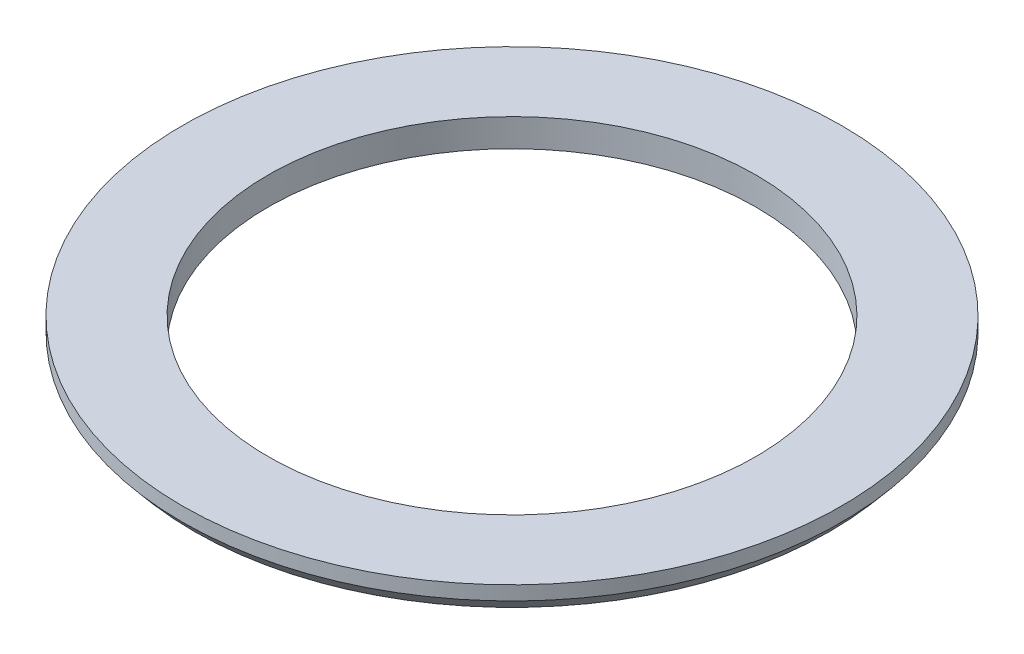
ISO-10303-21;
HEADER;
FILE_DESCRIPTION(('STEP AP214'),'2;1');
FILE_NAME('part.step','',(''),(''),'','','');
FILE_SCHEMA(('AUTOMOTIVE_DESIGN { 1 0 10303 214 1 1 1 1 }'));
ENDSEC;
DATA;
#1=APPLICATION_CONTEXT('core data for automotive mechanical design processes');
#2=APPLICATION_PROTOCOL_DEFINITION('international standard','automotive_design',2000,#1);
#3=PRODUCT_CONTEXT('',#1,'mechanical');
#4=PRODUCT('Part','Part','',(#3));
#5=PRODUCT_RELATED_PRODUCT_CATEGORY('part','',(#4));
#6=PRODUCT_DEFINITION_FORMATION('','',#4);
#7=PRODUCT_DEFINITION_CONTEXT('part definition',#1,'design');
#8=PRODUCT_DEFINITION('design','',#6,#7);
#9=PRODUCT_DEFINITION_SHAPE('','',#8);
#10=(LENGTH_UNIT() NAMED_UNIT(*) SI_UNIT(.MILLI.,.METRE.));
#11=(NAMED_UNIT(*) PLANE_ANGLE_UNIT() SI_UNIT($,.RADIAN.));
#12=(NAMED_UNIT(*) SI_UNIT($,.STERADIAN.) SOLID_ANGLE_UNIT());
#13=UNCERTAINTY_MEASURE_WITH_UNIT(LENGTH_MEASURE(1.E-05),#10,'distance_accuracy_value','');
#14=(GEOMETRIC_REPRESENTATION_CONTEXT(3) GLOBAL_UNCERTAINTY_ASSIGNED_CONTEXT((#13)) GLOBAL_UNIT_ASSIGNED_CONTEXT((#10,
#11,#12)) REPRESENTATION_CONTEXT('',''));
#15=CARTESIAN_POINT('',(0.,0.,0.));
#16=DIRECTION('',(0.,0.,1.));
#17=DIRECTION('',(1.,0.,0.));
#18=AXIS2_PLACEMENT_3D('',#15,#16,#17);
#19=CARTESIAN_POINT('',(0.,1.45677550974935,0.));
#20=DIRECTION('',(0.,-1.,0.));
#21=DIRECTION('',(0.,0.,-1.));
#22=AXIS2_PLACEMENT_3D('',#19,#20,#21);
#23=CONICAL_SURFACE('',#22,12.7598575613951,9.7776633074191E-05);
#24=CARTESIAN_POINT('',(0.,0.,0.));
#25=DIRECTION('',(0.,-1.,0.));
#26=DIRECTION('',(0.,0.,-1.));
#27=AXIS2_PLACEMENT_3D('',#24,#25,#26);
#28=CIRCLE('',#27,12.76);
#29=CARTESIAN_POINT('',(0.,0.,-12.76));
#30=VERTEX_POINT('',#29);
#31=EDGE_CURVE('E10',#30,#30,#28,.T.);
#32=ORIENTED_EDGE('',*,*,#31,.T.);
#33=EDGE_LOOP('',(#32));
#34=FACE_BOUND('',#33,.T.);
#35=CARTESIAN_POINT('',(0.,1.45677550974935,0.));
#36=DIRECTION('',(0.,-1.,0.));
#37=DIRECTION('',(0.,0.,-1.));
#38=AXIS2_PLACEMENT_3D('',#35,#36,#37);
#39=CIRCLE('',#38,12.7598575613951);
#40=CARTESIAN_POINT('',(0.,1.45677550974935,-12.7598575613951));
#41=VERTEX_POINT('',#40);
#42=EDGE_CURVE('E49',#41,#41,#39,.T.);
#43=ORIENTED_EDGE('',*,*,#42,.F.);
#44=EDGE_LOOP('',(#43));
#45=FACE_BOUND('',#44,.T.);
#46=ADVANCED_FACE('F30',(#34,#45),#23,.F.);
#47=CARTESIAN_POINT('',(0.,0.,0.));
#48=DIRECTION('',(0.,1.,0.));
#49=DIRECTION('',(0.,0.,1.));
#50=AXIS2_PLACEMENT_3D('',#47,#48,#49);
#51=CONICAL_SURFACE('',#50,12.76,1.57069855014956);
#52=CARTESIAN_POINT('',(0.,0.000378215050333974,0.));
#53=DIRECTION('',(0.,-1.,0.));
#54=DIRECTION('',(0.,0.,-1.));
#55=AXIS2_PLACEMENT_3D('',#52,#53,#54);
#56=CIRCLE('',#55,16.628153257104);
#57=CARTESIAN_POINT('',(0.,0.000378215050333974,-16.628153257104));
#58=VERTEX_POINT('',#57);
#59=EDGE_CURVE('E36',#58,#58,#56,.T.);
#60=ORIENTED_EDGE('',*,*,#59,.T.);
#61=EDGE_LOOP('',(#60));
#62=FACE_BOUND('',#61,.T.);
#63=ORIENTED_EDGE('',*,*,#31,.F.);
#64=EDGE_LOOP('',(#63));
#65=FACE_BOUND('',#64,.T.);
#66=ADVANCED_FACE('F57',(#62,#65),#51,.T.);
#67=CARTESIAN_POINT('',(0.,0.000378215050333974,0.));
#68=DIRECTION('',(0.,1.,0.));
#69=DIRECTION('',(0.,0.,1.));
#70=AXIS2_PLACEMENT_3D('',#67,#68,#69);
#71=CONICAL_SURFACE('',#70,16.628153257104,0.701041378124451);
#72=CARTESIAN_POINT('',(0.,0.723926381061293,0.));
#73=DIRECTION('',(0.,-1.,0.));
#74=DIRECTION('',(0.,0.,-1.));
#75=AXIS2_PLACEMENT_3D('',#72,#73,#74);
#76=CIRCLE('',#75,17.2388786498333);
#77=CARTESIAN_POINT('',(0.,0.723926381061293,-17.2388786498333));
#78=VERTEX_POINT('',#77);
#79=EDGE_CURVE('E40',#78,#78,#76,.T.);
#80=ORIENTED_EDGE('',*,*,#79,.T.);
#81=EDGE_LOOP('',(#80));
#82=FACE_BOUND('',#81,.T.);
#83=ORIENTED_EDGE('',*,*,#59,.F.);
#84=EDGE_LOOP('',(#83));
#85=FACE_BOUND('',#84,.T.);
#86=ADVANCED_FACE('F61',(#82,#85),#71,.T.);
#87=CARTESIAN_POINT('',(0.,0.723926381061293,0.));
#88=DIRECTION('',(0.,-1.,0.));
#89=DIRECTION('',(0.,0.,-1.));
#90=AXIS2_PLACEMENT_3D('',#87,#88,#89);
#91=CONICAL_SURFACE('',#90,17.2388786498333,9.7776554886035E-05);
#92=CARTESIAN_POINT('',(0.,1.45721344643998,0.));
#93=DIRECTION('',(0.,-1.,0.));
#94=DIRECTION('',(0.,0.,-1.));
#95=AXIS2_PLACEMENT_3D('',#92,#93,#94);
#96=CIRCLE('',#95,17.2388069515501);
#97=CARTESIAN_POINT('',(0.,1.45721344643998,-17.2388069515501));
#98=VERTEX_POINT('',#97);
#99=EDGE_CURVE('E44',#98,#98,#96,.T.);
#100=ORIENTED_EDGE('',*,*,#99,.T.);
#101=EDGE_LOOP('',(#100));
#102=FACE_BOUND('',#101,.T.);
#103=ORIENTED_EDGE('',*,*,#79,.F.);
#104=EDGE_LOOP('',(#103));
#105=FACE_BOUND('',#104,.T.);
#106=ADVANCED_FACE('F65',(#102,#105),#91,.T.);
#107=CARTESIAN_POINT('',(0.,1.45721344643998,0.));
#108=DIRECTION('',(0.,1.,0.));
#109=DIRECTION('',(0.,0.,1.));
#110=AXIS2_PLACEMENT_3D('',#107,#108,#109);
#111=CONICAL_SURFACE('',#110,17.2388069515501,1.57069855013991);
#112=ORIENTED_EDGE('',*,*,#42,.T.);
#113=EDGE_LOOP('',(#112));
#114=FACE_BOUND('',#113,.T.);
#115=ORIENTED_EDGE('',*,*,#99,.F.);
#116=EDGE_LOOP('',(#115));
#117=FACE_BOUND('',#116,.T.);
#118=ADVANCED_FACE('F53',(#114,#117),#111,.F.);
#119=CLOSED_SHELL('',(#46,#66,#86,#106,#118));
#120=MANIFOLD_SOLID_BREP('B2',#119);
#121=ADVANCED_BREP_SHAPE_REPRESENTATION('',(#18,#120),#14);
#122=SHAPE_DEFINITION_REPRESENTATION(#9,#121);
ENDSEC;
END-ISO-10303-21;
